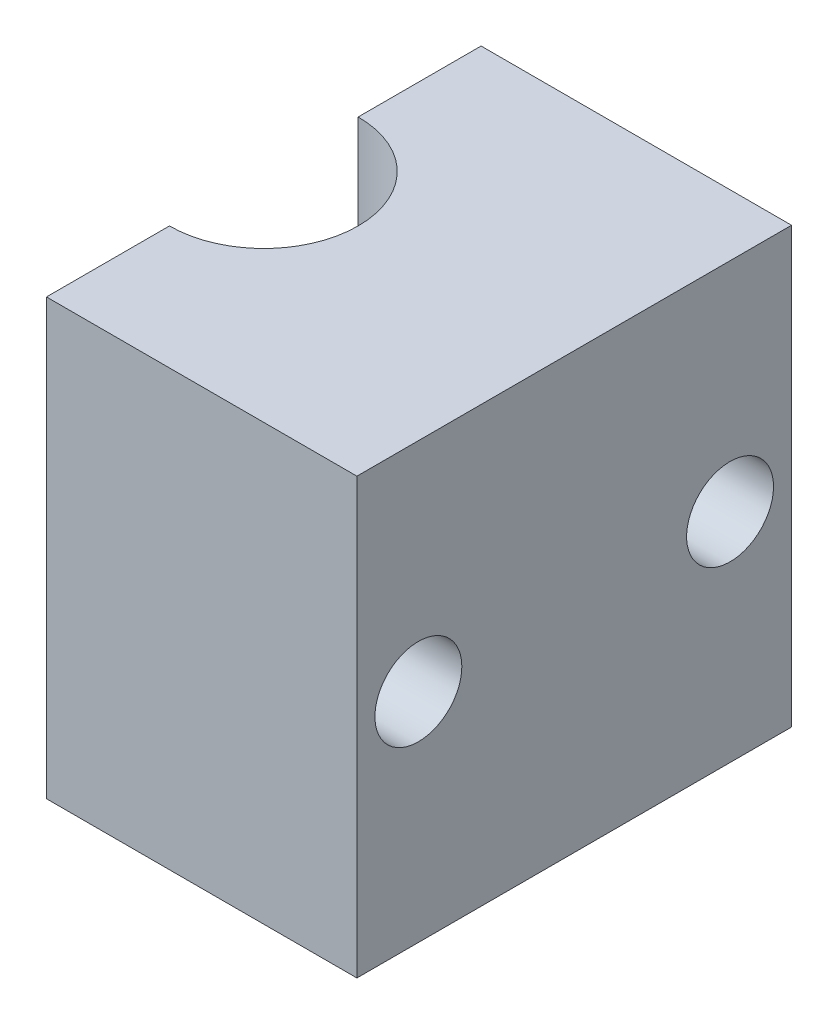
ISO-10303-21;
HEADER;
FILE_DESCRIPTION(('STEP AP214'),'2;1');
FILE_NAME('part.step','',(''),(''),'','','');
FILE_SCHEMA(('AUTOMOTIVE_DESIGN { 1 0 10303 214 1 1 1 1 }'));
ENDSEC;
DATA;
#1=APPLICATION_CONTEXT('core data for automotive mechanical design processes');
#2=APPLICATION_PROTOCOL_DEFINITION('international standard','automotive_design',2000,#1);
#3=PRODUCT_CONTEXT('',#1,'mechanical');
#4=PRODUCT('Part','Part','',(#3));
#5=PRODUCT_RELATED_PRODUCT_CATEGORY('part','',(#4));
#6=PRODUCT_DEFINITION_FORMATION('','',#4);
#7=PRODUCT_DEFINITION_CONTEXT('part definition',#1,'design');
#8=PRODUCT_DEFINITION('design','',#6,#7);
#9=PRODUCT_DEFINITION_SHAPE('','',#8);
#10=(LENGTH_UNIT() NAMED_UNIT(*) SI_UNIT(.MILLI.,.METRE.));
#11=(NAMED_UNIT(*) PLANE_ANGLE_UNIT() SI_UNIT($,.RADIAN.));
#12=(NAMED_UNIT(*) SI_UNIT($,.STERADIAN.) SOLID_ANGLE_UNIT());
#13=UNCERTAINTY_MEASURE_WITH_UNIT(LENGTH_MEASURE(1.E-05),#10,'distance_accuracy_value','');
#14=(GEOMETRIC_REPRESENTATION_CONTEXT(3) GLOBAL_UNCERTAINTY_ASSIGNED_CONTEXT((#13)) GLOBAL_UNIT_ASSIGNED_CONTEXT((#10,
#11,#12)) REPRESENTATION_CONTEXT('',''));
#15=CARTESIAN_POINT('',(0.,0.,0.));
#16=DIRECTION('',(0.,0.,1.));
#17=DIRECTION('',(1.,0.,0.));
#18=AXIS2_PLACEMENT_3D('',#15,#16,#17);
#19=CARTESIAN_POINT('',(-7.47999999999996,17.5,-12.55));
#20=DIRECTION('',(-1.,0.,0.));
#21=DIRECTION('',(0.,0.,1.));
#22=AXIS2_PLACEMENT_3D('',#19,#20,#21);
#23=CYLINDRICAL_SURFACE('',#22,1.5);
#24=CARTESIAN_POINT('',(-32.48,17.5,-12.55));
#25=DIRECTION('',(-1.,0.,0.));
#26=DIRECTION('',(0.,0.,1.));
#27=AXIS2_PLACEMENT_3D('',#24,#25,#26);
#28=CIRCLE('',#27,1.5);
#29=CARTESIAN_POINT('',(-32.48,17.5,-11.05));
#30=VERTEX_POINT('',#29);
#31=EDGE_CURVE('E216',#30,#30,#28,.T.);
#32=ORIENTED_EDGE('',*,*,#31,.T.);
#33=EDGE_LOOP('',(#32));
#34=FACE_BOUND('',#33,.T.);
#35=CARTESIAN_POINT('',(-12.48,17.5,-12.55));
#36=DIRECTION('',(1.,0.,0.));
#37=DIRECTION('',(0.,0.,-1.));
#38=AXIS2_PLACEMENT_3D('',#35,#36,#37);
#39=CIRCLE('',#38,1.5);
#40=CARTESIAN_POINT('',(-12.48,17.5,-14.05));
#41=VERTEX_POINT('',#40);
#42=EDGE_CURVE('E37',#41,#41,#39,.F.);
#43=ORIENTED_EDGE('',*,*,#42,.F.);
#44=EDGE_LOOP('',(#43));
#45=FACE_BOUND('',#44,.T.);
#46=ADVANCED_FACE('F33',(#34,#45),#23,.F.);
#47=CARTESIAN_POINT('',(-7.47999999999996,17.5,12.55));
#48=DIRECTION('',(-1.,0.,0.));
#49=DIRECTION('',(0.,0.,1.));
#50=AXIS2_PLACEMENT_3D('',#47,#48,#49);
#51=CYLINDRICAL_SURFACE('',#50,1.5);
#52=CARTESIAN_POINT('',(-32.48,17.5,12.55));
#53=DIRECTION('',(-1.,0.,0.));
#54=DIRECTION('',(0.,0.,1.));
#55=AXIS2_PLACEMENT_3D('',#52,#53,#54);
#56=CIRCLE('',#55,1.5);
#57=CARTESIAN_POINT('',(-32.48,17.5,14.05));
#58=VERTEX_POINT('',#57);
#59=EDGE_CURVE('E218',#58,#58,#56,.T.);
#60=ORIENTED_EDGE('',*,*,#59,.T.);
#61=EDGE_LOOP('',(#60));
#62=FACE_BOUND('',#61,.T.);
#63=CARTESIAN_POINT('',(-12.48,17.5,12.55));
#64=DIRECTION('',(1.,0.,0.));
#65=DIRECTION('',(0.,0.,-1.));
#66=AXIS2_PLACEMENT_3D('',#63,#64,#65);
#67=CIRCLE('',#66,1.5);
#68=CARTESIAN_POINT('',(-12.48,17.5,11.05));
#69=VERTEX_POINT('',#68);
#70=EDGE_CURVE('E143',#69,#69,#67,.F.);
#71=ORIENTED_EDGE('',*,*,#70,.F.);
#72=EDGE_LOOP('',(#71));
#73=FACE_BOUND('',#72,.T.);
#74=ADVANCED_FACE('F172',(#62,#73),#51,.F.);
#75=CARTESIAN_POINT('',(-7.47999999999997,35.,-17.5));
#76=DIRECTION('',(-1.,0.,0.));
#77=DIRECTION('',(0.,0.,1.));
#78=AXIS2_PLACEMENT_3D('',#75,#76,#77);
#79=PLANE('',#78);
#80=CARTESIAN_POINT('',(-7.47999999999996,17.5,-12.55));
#81=DIRECTION('',(1.,0.,0.));
#82=DIRECTION('',(0.,0.,-1.));
#83=AXIS2_PLACEMENT_3D('',#80,#81,#82);
#84=CIRCLE('',#83,3.5);
#85=CARTESIAN_POINT('',(-7.47999999999996,17.5,-16.05));
#86=VERTEX_POINT('',#85);
#87=EDGE_CURVE('E209',#86,#86,#84,.T.);
#88=ORIENTED_EDGE('',*,*,#87,.F.);
#89=EDGE_LOOP('',(#88));
#90=FACE_BOUND('',#89,.T.);
#91=CARTESIAN_POINT('',(-7.47999999999996,17.5,12.55));
#92=DIRECTION('',(1.,0.,0.));
#93=DIRECTION('',(0.,0.,-1.));
#94=AXIS2_PLACEMENT_3D('',#91,#92,#93);
#95=CIRCLE('',#94,3.5);
#96=CARTESIAN_POINT('',(-7.47999999999996,17.5,9.05));
#97=VERTEX_POINT('',#96);
#98=EDGE_CURVE('E205',#97,#97,#95,.T.);
#99=ORIENTED_EDGE('',*,*,#98,.F.);
#100=EDGE_LOOP('',(#99));
#101=FACE_BOUND('',#100,.T.);
#102=DIRECTION('',(0.,0.,-1.));
#103=VECTOR('',#102,1.);
#104=CARTESIAN_POINT('',(-7.47999999999997,0.,-17.5));
#105=LINE('',#104,#103);
#106=CARTESIAN_POINT('',(-7.47999999999996,0.,17.5));
#107=VERTEX_POINT('',#106);
#108=CARTESIAN_POINT('',(-7.47999999999997,0.,-17.5));
#109=VERTEX_POINT('',#108);
#110=EDGE_CURVE('E120',#107,#109,#105,.T.);
#111=ORIENTED_EDGE('',*,*,#110,.T.);
#112=DIRECTION('',(0.,-1.,0.));
#113=VECTOR('',#112,1.);
#114=CARTESIAN_POINT('',(-7.47999999999997,35.,-17.5));
#115=LINE('',#114,#113);
#116=CARTESIAN_POINT('',(-7.47999999999997,35.,-17.5));
#117=VERTEX_POINT('',#116);
#118=EDGE_CURVE('E11',#117,#109,#115,.T.);
#119=ORIENTED_EDGE('',*,*,#118,.F.);
#120=DIRECTION('',(0.,0.,-1.));
#121=VECTOR('',#120,1.);
#122=CARTESIAN_POINT('',(-7.47999999999997,35.,-17.5));
#123=LINE('',#122,#121);
#124=CARTESIAN_POINT('',(-7.47999999999996,35.,17.5));
#125=VERTEX_POINT('',#124);
#126=EDGE_CURVE('E131',#125,#117,#123,.T.);
#127=ORIENTED_EDGE('',*,*,#126,.F.);
#128=DIRECTION('',(0.,-1.,0.));
#129=VECTOR('',#128,1.);
#130=CARTESIAN_POINT('',(-7.47999999999996,35.,17.5));
#131=LINE('',#130,#129);
#132=EDGE_CURVE('E116',#125,#107,#131,.T.);
#133=ORIENTED_EDGE('',*,*,#132,.T.);
#134=EDGE_LOOP('',(#111,#119,#127,#133));
#135=FACE_BOUND('',#134,.T.);
#136=ADVANCED_FACE('F35',(#90,#101,#135),#79,.F.);
#137=CARTESIAN_POINT('',(-32.48,35.,-17.5));
#138=DIRECTION('',(0.,0.,1.));
#139=DIRECTION('',(1.,0.,0.));
#140=AXIS2_PLACEMENT_3D('',#137,#138,#139);
#141=PLANE('',#140);
#142=DIRECTION('',(-1.,0.,0.));
#143=VECTOR('',#142,1.);
#144=CARTESIAN_POINT('',(-32.48,0.,-17.5));
#145=LINE('',#144,#143);
#146=CARTESIAN_POINT('',(-32.48,0.,-17.5));
#147=VERTEX_POINT('',#146);
#148=EDGE_CURVE('E123',#109,#147,#145,.T.);
#149=ORIENTED_EDGE('',*,*,#148,.T.);
#150=DIRECTION('',(0.,-1.,0.));
#151=VECTOR('',#150,1.);
#152=CARTESIAN_POINT('',(-32.48,35.,-17.5));
#153=LINE('',#152,#151);
#154=CARTESIAN_POINT('',(-32.48,35.,-17.5));
#155=VERTEX_POINT('',#154);
#156=EDGE_CURVE('E43',#155,#147,#153,.T.);
#157=ORIENTED_EDGE('',*,*,#156,.F.);
#158=DIRECTION('',(-1.,0.,0.));
#159=VECTOR('',#158,1.);
#160=CARTESIAN_POINT('',(-32.48,35.,-17.5));
#161=LINE('',#160,#159);
#162=EDGE_CURVE('E89',#117,#155,#161,.T.);
#163=ORIENTED_EDGE('',*,*,#162,.F.);
#164=ORIENTED_EDGE('',*,*,#118,.T.);
#165=EDGE_LOOP('',(#149,#157,#163,#164));
#166=FACE_BOUND('',#165,.T.);
#167=ADVANCED_FACE('F226',(#166),#141,.F.);
#168=CARTESIAN_POINT('',(-32.48,35.,-17.5));
#169=DIRECTION('',(1.,0.,0.));
#170=DIRECTION('',(0.,0.,-1.));
#171=AXIS2_PLACEMENT_3D('',#168,#169,#170);
#172=PLANE('',#171);
#173=ORIENTED_EDGE('',*,*,#31,.F.);
#174=EDGE_LOOP('',(#173));
#175=FACE_BOUND('',#174,.T.);
#176=DIRECTION('',(0.,0.,1.));
#177=VECTOR('',#176,1.);
#178=CARTESIAN_POINT('',(-32.48,0.,-17.5));
#179=LINE('',#178,#177);
#180=CARTESIAN_POINT('',(-32.48,0.,-7.6));
#181=VERTEX_POINT('',#180);
#182=EDGE_CURVE('E126',#147,#181,#179,.T.);
#183=ORIENTED_EDGE('',*,*,#182,.T.);
#184=DIRECTION('',(0.,-1.,0.));
#185=VECTOR('',#184,1.);
#186=CARTESIAN_POINT('',(-32.48,35.,-7.6));
#187=LINE('',#186,#185);
#188=CARTESIAN_POINT('',(-32.48,35.,-7.6));
#189=VERTEX_POINT('',#188);
#190=EDGE_CURVE('E111',#189,#181,#187,.T.);
#191=ORIENTED_EDGE('',*,*,#190,.F.);
#192=DIRECTION('',(0.,0.,1.));
#193=VECTOR('',#192,1.);
#194=CARTESIAN_POINT('',(-32.48,35.,-17.5));
#195=LINE('',#194,#193);
#196=EDGE_CURVE('E102',#155,#189,#195,.T.);
#197=ORIENTED_EDGE('',*,*,#196,.F.);
#198=ORIENTED_EDGE('',*,*,#156,.T.);
#199=EDGE_LOOP('',(#183,#191,#197,#198));
#200=FACE_BOUND('',#199,.T.);
#201=ADVANCED_FACE('F168',(#175,#200),#172,.F.);
#202=CARTESIAN_POINT('',(-32.48,35.,0.));
#203=DIRECTION('',(0.,-1.,0.));
#204=DIRECTION('',(0.,0.,-1.));
#205=AXIS2_PLACEMENT_3D('',#202,#203,#204);
#206=CYLINDRICAL_SURFACE('',#205,7.6);
#207=CARTESIAN_POINT('',(-28.2291177386335,17.5,6.3));
#208=CARTESIAN_POINT('',(-28.2291148667617,17.3876842680063,6.29999891589043));
#209=CARTESIAN_POINT('',(-28.2246436188237,17.2753446664707,6.29698826054719));
#210=CARTESIAN_POINT('',(-28.2069940748641,17.0516296229765,6.28502415434351));
#211=CARTESIAN_POINT('',(-28.1938106769283,16.9402547847332,6.27606722127469));
#212=CARTESIAN_POINT('',(-28.1593745748084,16.7191258820914,6.25240993582619));
#213=CARTESIAN_POINT('',(-28.138103153279,16.609376195381,6.23769625885356));
#214=CARTESIAN_POINT('',(-28.0884451351719,16.3923298306676,6.20283512891558));
#215=CARTESIAN_POINT('',(-28.0600537000576,16.285034875151,6.18268398010548));
#216=CARTESIAN_POINT('',(-27.9852298848271,16.032864347817,6.12861355421361));
#217=CARTESIAN_POINT('',(-27.9360497326561,15.8893005439857,6.09237577987049));
#218=CARTESIAN_POINT('',(-27.8289582653047,15.6081463994727,6.01101721926835));
#219=CARTESIAN_POINT('',(-27.7710461269135,15.4705566235713,5.96589559535881));
#220=CARTESIAN_POINT('',(-27.6487157699404,15.2009167005678,5.86727206914997));
#221=CARTESIAN_POINT('',(-27.5842794581535,15.0688834807602,5.81374662158453));
#222=CARTESIAN_POINT('',(-27.4510240837794,14.8106087532586,5.69887255128853));
#223=CARTESIAN_POINT('',(-27.3822052058591,14.6843670019163,5.63752425807804));
#224=CARTESIAN_POINT('',(-27.2113716052765,14.3839640999135,5.47908367508974));
#225=CARTESIAN_POINT('',(-27.107886301832,14.2127238063655,5.378016652942));
#226=CARTESIAN_POINT('',(-26.8989140641327,13.8812945715832,5.16083612367827));
#227=CARTESIAN_POINT('',(-26.793426307125,13.7211103040112,5.04471631234436));
#228=CARTESIAN_POINT('',(-26.5835429063655,13.4120858826402,4.79771213843507));
#229=CARTESIAN_POINT('',(-26.4791463445872,13.2632353962409,4.6668415003635));
#230=CARTESIAN_POINT('',(-26.2739689742349,12.9773106465582,4.39030851426602));
#231=CARTESIAN_POINT('',(-26.1731868294553,12.8402320046795,4.24465171040154));
#232=CARTESIAN_POINT('',(-25.9982045359767,12.606294721921,3.97075694772539));
#233=CARTESIAN_POINT('',(-25.9228680567328,12.5070365876203,3.84528837483925));
#234=CARTESIAN_POINT('',(-25.7771612774346,12.3171675192557,3.58526866656152));
#235=CARTESIAN_POINT('',(-25.7067898449166,12.2265546116545,3.45071961609839));
#236=CARTESIAN_POINT('',(-25.5723004854362,12.0548965423894,3.1729282219673));
#237=CARTESIAN_POINT('',(-25.5081750963299,11.9738399388274,3.02969659185429));
#238=CARTESIAN_POINT('',(-25.3873244793331,11.8221352403215,2.73483529019645));
#239=CARTESIAN_POINT('',(-25.3305979246341,11.7514852788942,2.58320713134007));
#240=CARTESIAN_POINT('',(-25.2347580422013,11.632757279972,2.29890413128772));
#241=CARTESIAN_POINT('',(-25.1942921518868,11.5828858175031,2.16743222006261));
#242=CARTESIAN_POINT('',(-25.1199646364904,11.4916039535611,1.8997788370325));
#243=CARTESIAN_POINT('',(-25.0861016861818,11.450191854193,1.76359831673001));
#244=CARTESIAN_POINT('',(-25.025606213637,11.3764035975787,1.48728182851436));
#245=CARTESIAN_POINT('',(-24.9989712143717,11.3440243446565,1.34714723388964));
#246=CARTESIAN_POINT('',(-24.9534473235846,11.288781093121,1.06376517847891));
#247=CARTESIAN_POINT('',(-24.9345585216492,11.265917204555,0.920517681711699));
#248=CARTESIAN_POINT('',(-24.9048691218204,11.2300151215662,0.631349565653004));
#249=CARTESIAN_POINT('',(-24.894102405656,11.2170180858494,0.485420321716768));
#250=CARTESIAN_POINT('',(-24.8810285380954,11.2012392584048,0.192629635579012));
#251=CARTESIAN_POINT('',(-24.8787214042574,11.1984574878794,0.0457681914432892));
#252=CARTESIAN_POINT('',(-24.8826196031196,11.2031602678055,-0.247671203877243));
#253=CARTESIAN_POINT('',(-24.8888246727292,11.2106445009608,-0.394249163683621));
#254=CARTESIAN_POINT('',(-24.9096048823799,11.2357417422201,-0.685927509131543));
#255=CARTESIAN_POINT('',(-24.9241797479161,11.2533544181407,-0.831027943072809));
#256=CARTESIAN_POINT('',(-24.9601548982718,11.2969192171474,-1.10917958956484));
#257=CARTESIAN_POINT('',(-24.9810433055621,11.3222467612419,-1.24239568120999));
#258=CARTESIAN_POINT('',(-25.0294592662667,11.3811084381429,-1.50579038684641));
#259=CARTESIAN_POINT('',(-25.0569890677703,11.414645349849,-1.63596795590872));
#260=CARTESIAN_POINT('',(-25.1488506908093,11.52692465627,-2.02080242297498));
#261=CARTESIAN_POINT('',(-25.2224803647418,11.6173663245905,-2.26995200003625));
#262=CARTESIAN_POINT('',(-25.3973855562712,11.8344963184363,-2.76999540781246));
#263=CARTESIAN_POINT('',(-25.5005140021505,11.9636605237383,-3.01914097812484));
#264=CARTESIAN_POINT('',(-25.7248027336431,12.2492395714563,-3.49227021333204));
#265=CARTESIAN_POINT('',(-25.8459703161263,12.4056654456657,-3.71624363139885));
#266=CARTESIAN_POINT('',(-26.1270477818407,12.776886324244,-4.18191258451981));
#267=CARTESIAN_POINT('',(-26.2897788274774,12.9970573327389,-4.41763651030811));
#268=CARTESIAN_POINT('',(-26.5395819443368,13.3496530337498,-4.74238470095639));
#269=CARTESIAN_POINT('',(-26.6239017924029,13.4710618538864,-4.84593103768238));
#270=CARTESIAN_POINT('',(-26.7930594241733,13.7211379220807,-5.04336902181316));
#271=CARTESIAN_POINT('',(-26.8778970519519,13.8498030726622,-5.13726343722415));
#272=CARTESIAN_POINT('',(-27.0466600760135,14.1145022632636,-5.31543959380166));
#273=CARTESIAN_POINT('',(-27.1305841235825,14.250545785903,-5.39970851087025));
#274=CARTESIAN_POINT('',(-27.2955933491775,14.5300155710736,-5.55832885773833));
#275=CARTESIAN_POINT('',(-27.3766778629516,14.6734435419193,-5.63267797828019));
#276=CARTESIAN_POINT('',(-27.533577098543,14.967696933412,-5.77094533677907));
#277=CARTESIAN_POINT('',(-27.6094005263806,15.1185093927643,-5.83488105508983));
#278=CARTESIAN_POINT('',(-27.752973963889,15.4279060539942,-5.95178872919635));
#279=CARTESIAN_POINT('',(-27.8207291489018,15.5864851808238,-6.00476772938125));
#280=CARTESIAN_POINT('',(-27.9593715552867,15.9505992017644,-6.11009081420478));
#281=CARTESIAN_POINT('',(-28.0271588065035,16.1583196880072,-6.15927621478926));
#282=CARTESIAN_POINT('',(-28.1090872104217,16.4775274861947,-6.21741476862343));
#283=CARTESIAN_POINT('',(-28.1330944089649,16.5851210905542,-6.23418124020503));
#284=CARTESIAN_POINT('',(-28.1735777291982,16.8024015953788,-6.26221491746038));
#285=CARTESIAN_POINT('',(-28.1900576679881,16.9120874054146,-6.27348491061459));
#286=CARTESIAN_POINT('',(-28.2148218684258,17.1339276795261,-6.29034865862891));
#287=CARTESIAN_POINT('',(-28.2230236737441,17.2460958225234,-6.29588531911609));
#288=CARTESIAN_POINT('',(-28.2305016550264,17.4708647747704,-6.30093525977525));
#289=CARTESIAN_POINT('',(-28.2297782817618,17.5834655618821,-6.30044884414625));
#290=CARTESIAN_POINT('',(-28.2194433757939,17.8081311717192,-6.2934644477628));
#291=CARTESIAN_POINT('',(-28.2098265980821,17.9201956389355,-6.28696291951132));
#292=CARTESIAN_POINT('',(-28.1822084344889,18.1428300742866,-6.26811479208689));
#293=CARTESIAN_POINT('',(-28.1642024187999,18.2533991824545,-6.25576496532463));
#294=CARTESIAN_POINT('',(-28.1168763616563,18.4913134198957,-6.22287066988253));
#295=CARTESIAN_POINT('',(-28.0861324497654,18.6182283514023,-6.20127394343811));
#296=CARTESIAN_POINT('',(-28.0159600046969,18.8682402519501,-6.15095152070373));
#297=CARTESIAN_POINT('',(-27.9765246273369,18.9913341244213,-6.1222202039368));
#298=CARTESIAN_POINT('',(-27.8906095465501,19.2336013878572,-6.05808320216905));
#299=CARTESIAN_POINT('',(-27.8441116885444,19.3527636827937,-6.02266025698543));
#300=CARTESIAN_POINT('',(-27.7457458783019,19.5867247627257,-5.94564918042104));
#301=CARTESIAN_POINT('',(-27.6938792403603,19.7015246063003,-5.9040625568578));
#302=CARTESIAN_POINT('',(-27.5552377346005,19.9915033323525,-5.78953950835156));
#303=CARTESIAN_POINT('',(-27.4654948792831,20.1635724692422,-5.71229713715119));
#304=CARTESIAN_POINT('',(-27.2802792028258,20.4977357786889,-5.54423825051071));
#305=CARTESIAN_POINT('',(-27.1848033104559,20.659824508786,-5.45341441985093));
#306=CARTESIAN_POINT('',(-26.9912090982867,20.9745095462878,-5.25852339146182));
#307=CARTESIAN_POINT('',(-26.8930876119238,21.1270936825491,-5.15443971259749));
#308=CARTESIAN_POINT('',(-26.6969049011666,21.4225467230691,-4.93332167186165));
#309=CARTESIAN_POINT('',(-26.5988436687895,21.5654174996955,-4.81628981740052));
#310=CARTESIAN_POINT('',(-26.4015406303922,21.8460282198451,-4.56494800141081));
#311=CARTESIAN_POINT('',(-26.3023786751636,21.9834107870859,-4.43017500747694));
#312=CARTESIAN_POINT('',(-26.1086724079017,22.2467635836205,-4.14676390359023));
#313=CARTESIAN_POINT('',(-26.0141288849732,22.3727318657922,-3.99812343677923));
#314=CARTESIAN_POINT('',(-25.8320937334107,22.6118140553739,-3.68750230180722));
#315=CARTESIAN_POINT('',(-25.7445854448835,22.7249586074786,-3.52555510314334));
#316=CARTESIAN_POINT('',(-25.5786054999644,22.9372438484052,-3.18841829787242));
#317=CARTESIAN_POINT('',(-25.5001294291928,23.0363913835031,-3.01323523006912));
#318=CARTESIAN_POINT('',(-25.3764582241842,23.1913771086439,-2.70524056587205));
#319=CARTESIAN_POINT('',(-25.3283686097291,23.2512532066442,-2.57560582704288));
#320=CARTESIAN_POINT('',(-25.2384474810082,23.3626928516526,-2.31072786613414));
#321=CARTESIAN_POINT('',(-25.1966143428542,23.4142585559203,-2.17548611105361));
#322=CARTESIAN_POINT('',(-25.1199561698433,23.5084100695072,-1.90004733353403));
#323=CARTESIAN_POINT('',(-25.0851277751227,23.5510001844887,-1.75985272487912));
#324=CARTESIAN_POINT('',(-25.0231307595864,23.6266114266542,-1.47523235097785));
#325=CARTESIAN_POINT('',(-24.9959623403022,23.6596323020755,-1.33080647451856));
#326=CARTESIAN_POINT('',(-24.949727661416,23.7157264699867,-1.03784208480373));
#327=CARTESIAN_POINT('',(-24.9307101970095,23.7387398649405,-0.889284321101167));
#328=CARTESIAN_POINT('',(-24.9014482515707,23.7741171231678,-0.590043227206412));
#329=CARTESIAN_POINT('',(-24.8912037546336,23.7864810057482,-0.439359900868241));
#330=CARTESIAN_POINT('',(-24.8797343037823,23.8003217123168,-0.137179204972387));
#331=CARTESIAN_POINT('',(-24.8785075969892,23.8018006521212,0.0143180006536518));
#332=CARTESIAN_POINT('',(-24.8850998400524,23.7938472838726,0.316821053009321));
#333=CARTESIAN_POINT('',(-24.8929182274742,23.7844156542513,0.467826929704872));
#334=CARTESIAN_POINT('',(-24.9162992223677,23.7561669755145,0.754454581287962));
#335=CARTESIAN_POINT('',(-24.9310971073584,23.7382763556765,0.890232055368254));
#336=CARTESIAN_POINT('',(-24.9677343739589,23.6938914821568,1.15945154333634));
#337=CARTESIAN_POINT('',(-24.9895761017991,23.6673943617189,1.29289276340646));
#338=CARTESIAN_POINT('',(-25.0398957670989,23.6061817379029,1.55655099521716));
#339=CARTESIAN_POINT('',(-25.0683716373066,23.5714687945876,1.68676899738382));
#340=CARTESIAN_POINT('',(-25.1314768225135,23.4942708630513,1.94337239558163));
#341=CARTESIAN_POINT('',(-25.1661084551758,23.4517829473516,2.06975632701921));
#342=CARTESIAN_POINT('',(-25.2822537247504,23.3086825310549,2.45491059628991));
#343=CARTESIAN_POINT('',(-25.3734121964029,23.1955688080937,2.70627660887144));
#344=CARTESIAN_POINT('',(-25.5751600602669,22.9417606483167,3.18608224196091));
#345=CARTESIAN_POINT('',(-25.6857615104558,22.8010490898135,3.41450749632662));
#346=CARTESIAN_POINT('',(-25.8896495823876,22.5366439528865,3.78945274411982));
#347=CARTESIAN_POINT('',(-25.9797311628983,22.4183589801478,3.94161130825643));
#348=CARTESIAN_POINT('',(-26.1653598466776,22.1702745217663,4.23262306368358));
#349=CARTESIAN_POINT('',(-26.2609071057013,22.0404747079278,4.3714758754993));
#350=CARTESIAN_POINT('',(-26.4556004563345,21.769922965726,4.63612608593521));
#351=CARTESIAN_POINT('',(-26.554754799357,21.6291449581162,4.76189063112206));
#352=CARTESIAN_POINT('',(-26.7542105339638,21.3374483406922,4.9999427628734));
#353=CARTESIAN_POINT('',(-26.8545116442753,21.1865321750381,5.11223357969553));
#354=CARTESIAN_POINT('',(-27.0395765963301,20.8968778891476,5.30822812696452));
#355=CARTESIAN_POINT('',(-27.1245195540585,20.7594646965631,5.39372577998232));
#356=CARTESIAN_POINT('',(-27.2915396397985,20.4770958717542,5.55457601909729));
#357=CARTESIAN_POINT('',(-27.3736162608265,20.332138916404,5.62992681713243));
#358=CARTESIAN_POINT('',(-27.5323590172065,20.0347422291701,5.76992348777546));
#359=CARTESIAN_POINT('',(-27.6090370183953,19.8823202413963,5.83459328661982));
#360=CARTESIAN_POINT('',(-27.7541365360769,19.5695420393742,5.95272711294352));
#361=CARTESIAN_POINT('',(-27.8225635908837,19.4091912502989,6.00619867502128));
#362=CARTESIAN_POINT('',(-27.9635449842395,19.03780044759,6.11321258238597));
#363=CARTESIAN_POINT('',(-28.0326391789985,18.8243256589866,6.16324021264061));
#364=CARTESIAN_POINT('',(-28.11520355897,18.4963085162756,6.22171116624102));
#365=CARTESIAN_POINT('',(-28.1391944303077,18.3858191047931,6.23842858545271));
#366=CARTESIAN_POINT('',(-28.1791663545855,18.162705466062,6.26605347855055));
#367=CARTESIAN_POINT('',(-28.1951525995596,18.0500826719227,6.27696471878256));
#368=CARTESIAN_POINT('',(-28.2141388622078,17.8643849908895,6.28987315674008));
#369=CARTESIAN_POINT('',(-28.2197428100901,17.7916887616836,6.29366581895905));
#370=CARTESIAN_POINT('',(-28.2272336332556,17.6459984285663,6.29872989923891));
#371=CARTESIAN_POINT('',(-28.2291196053254,17.57300425659,6.30000070466187));
#372=CARTESIAN_POINT('',(-28.2291177386335,17.5,6.3));
#373=B_SPLINE_CURVE_WITH_KNOTS('',3,(#207,#208,#209,#210,#211,#212,#213,#214,#215,#216,#217,
#218,#219,#220,#221,#222,#223,#224,#225,#226,#227,#228,#229,#230,#231,#232,#233,#234,#235,#236,
#237,#238,#239,#240,#241,#242,#243,#244,#245,#246,#247,#248,#249,#250,#251,#252,#253,#254,#255,
#256,#257,#258,#259,#260,#261,#262,#263,#264,#265,#266,#267,#268,#269,#270,#271,#272,#273,#274,
#275,#276,#277,#278,#279,#280,#281,#282,#283,#284,#285,#286,#287,#288,#289,#290,#291,#292,#293,
#294,#295,#296,#297,#298,#299,#300,#301,#302,#303,#304,#305,#306,#307,#308,#309,#310,#311,#312,
#313,#314,#315,#316,#317,#318,#319,#320,#321,#322,#323,#324,#325,#326,#327,#328,#329,#330,#331,
#332,#333,#334,#335,#336,#337,#338,#339,#340,#341,#342,#343,#344,#345,#346,#347,#348,#349,#350,
#351,#352,#353,#354,#355,#356,#357,#358,#359,#360,#361,#362,#363,#364,#365,#366,#367,#368,#369,
#370,#371,#372),.UNSPECIFIED.,.T.,.F.,(4,2,2,2,2,2,2,2,2,2,2,2,2,2,2,2,2,2,2,2,2,2,2,2,2,2,2,2,
2,2,2,2,2,2,2,2,2,2,2,2,2,2,2,2,2,2,2,2,2,2,2,2,2,2,2,2,2,2,2,2,2,2,2,2,2,2,2,2,2,2,2,2,2,2,2,2,
2,2,2,2,2,2,4),(0.,0.336862724400323,0.673922893692781,1.01176788422578,1.34984308866481,
1.81714411276208,2.28448921938959,2.75316786897793,3.22182678303305,3.89342277078507,
4.56530094208076,5.23655906414683,5.90756641715968,6.4376027698613,6.96751783459118,
7.49679183858947,8.02597079875074,8.4644965340255,8.90293416529224,9.34122135306741,
9.77951360958293,10.2196242670346,10.6597358379611,11.099833806456,11.5399173418412,
11.9510604435469,12.3623429115526,13.1843291742837,14.0781081476452,14.9722496438158,
16.051990776399,16.5931171604857,17.134087923265,17.6757712184493,18.2175803944257,
18.7584704791481,19.2990117215213,19.9683403638309,20.3025239980539,20.6365379779205,
20.9738470910011,21.3111391681546,21.6486302949317,21.9863078955147,22.3827668308614,
22.7795390843997,23.1773490908431,23.5750619413596,24.2007470146848,24.8267703153311,
25.453579456029,26.0802674270757,26.7290044301291,27.3778518913869,28.0251145752359,
28.672059562306,29.1236715792875,29.5751661747503,30.0264436891305,30.4777330753636,
30.9316875722131,31.3856412460681,31.8395066780317,32.293343889635,32.7061169588173,
33.1190276606348,33.5318098678483,33.9447478192631,34.8122144808797,35.6802210306484,
36.3176502345245,36.9550976122231,37.5941083234281,38.232965527671,38.7808735387864,
39.3288779753512,39.875637683995,40.4220283215773,41.1088645335448,41.4513826102302,
41.7936782309742,42.0125829226509,42.2315407866222),.UNSPECIFIED.);
#374=CARTESIAN_POINT('',(-28.2291177386335,17.5,6.3));
#375=VERTEX_POINT('',#374);
#376=EDGE_CURVE('E124',#375,#375,#373,.T.);
#377=ORIENTED_EDGE('',*,*,#376,.T.);
#378=EDGE_LOOP('',(#377));
#379=FACE_BOUND('',#378,.T.);
#380=CARTESIAN_POINT('',(-32.48,0.,0.));
#381=DIRECTION('',(0.,-1.,0.));
#382=DIRECTION('',(0.,0.,1.));
#383=AXIS2_PLACEMENT_3D('',#380,#381,#382);
#384=CIRCLE('',#383,7.6);
#385=CARTESIAN_POINT('',(-32.48,0.,7.6));
#386=VERTEX_POINT('',#385);
#387=EDGE_CURVE('E110',#181,#386,#384,.T.);
#388=ORIENTED_EDGE('',*,*,#387,.T.);
#389=DIRECTION('',(0.,-1.,0.));
#390=VECTOR('',#389,1.);
#391=CARTESIAN_POINT('',(-32.48,35.,7.6));
#392=LINE('',#391,#390);
#393=CARTESIAN_POINT('',(-32.48,35.,7.6));
#394=VERTEX_POINT('',#393);
#395=EDGE_CURVE('E107',#394,#386,#392,.T.);
#396=ORIENTED_EDGE('',*,*,#395,.F.);
#397=CARTESIAN_POINT('',(-32.48,35.,0.));
#398=DIRECTION('',(0.,-1.,0.));
#399=DIRECTION('',(0.,0.,1.));
#400=AXIS2_PLACEMENT_3D('',#397,#398,#399);
#401=CIRCLE('',#400,7.6);
#402=EDGE_CURVE('E96',#189,#394,#401,.T.);
#403=ORIENTED_EDGE('',*,*,#402,.F.);
#404=ORIENTED_EDGE('',*,*,#190,.T.);
#405=EDGE_LOOP('',(#388,#396,#403,#404));
#406=FACE_BOUND('',#405,.T.);
#407=ADVANCED_FACE('F108',(#379,#406),#206,.F.);
#408=CARTESIAN_POINT('',(-32.48,35.,7.6));
#409=DIRECTION('',(1.,0.,0.));
#410=DIRECTION('',(0.,0.,-1.));
#411=AXIS2_PLACEMENT_3D('',#408,#409,#410);
#412=PLANE('',#411);
#413=ORIENTED_EDGE('',*,*,#59,.F.);
#414=EDGE_LOOP('',(#413));
#415=FACE_BOUND('',#414,.T.);
#416=DIRECTION('',(0.,0.,1.));
#417=VECTOR('',#416,1.);
#418=CARTESIAN_POINT('',(-32.48,0.,7.6));
#419=LINE('',#418,#417);
#420=CARTESIAN_POINT('',(-32.48,0.,17.5));
#421=VERTEX_POINT('',#420);
#422=EDGE_CURVE('E75',#386,#421,#419,.T.);
#423=ORIENTED_EDGE('',*,*,#422,.T.);
#424=DIRECTION('',(0.,-1.,0.));
#425=VECTOR('',#424,1.);
#426=CARTESIAN_POINT('',(-32.48,35.,17.5));
#427=LINE('',#426,#425);
#428=CARTESIAN_POINT('',(-32.48,35.,17.5));
#429=VERTEX_POINT('',#428);
#430=EDGE_CURVE('E112',#429,#421,#427,.T.);
#431=ORIENTED_EDGE('',*,*,#430,.F.);
#432=DIRECTION('',(0.,0.,1.));
#433=VECTOR('',#432,1.);
#434=CARTESIAN_POINT('',(-32.48,35.,7.6));
#435=LINE('',#434,#433);
#436=EDGE_CURVE('E100',#394,#429,#435,.T.);
#437=ORIENTED_EDGE('',*,*,#436,.F.);
#438=ORIENTED_EDGE('',*,*,#395,.T.);
#439=EDGE_LOOP('',(#423,#431,#437,#438));
#440=FACE_BOUND('',#439,.T.);
#441=ADVANCED_FACE('F114',(#415,#440),#412,.F.);
#442=CARTESIAN_POINT('',(-32.48,35.,17.5));
#443=DIRECTION('',(0.,0.,-1.));
#444=DIRECTION('',(-1.,0.,0.));
#445=AXIS2_PLACEMENT_3D('',#442,#443,#444);
#446=PLANE('',#445);
#447=DIRECTION('',(1.,0.,0.));
#448=VECTOR('',#447,1.);
#449=CARTESIAN_POINT('',(-32.48,0.,17.5));
#450=LINE('',#449,#448);
#451=EDGE_CURVE('E81',#421,#107,#450,.T.);
#452=ORIENTED_EDGE('',*,*,#451,.T.);
#453=ORIENTED_EDGE('',*,*,#132,.F.);
#454=DIRECTION('',(1.,0.,0.));
#455=VECTOR('',#454,1.);
#456=CARTESIAN_POINT('',(-32.48,35.,17.5));
#457=LINE('',#456,#455);
#458=EDGE_CURVE('E52',#429,#125,#457,.T.);
#459=ORIENTED_EDGE('',*,*,#458,.F.);
#460=ORIENTED_EDGE('',*,*,#430,.T.);
#461=EDGE_LOOP('',(#452,#453,#459,#460));
#462=FACE_BOUND('',#461,.T.);
#463=ADVANCED_FACE('F158',(#462),#446,.F.);
#464=CARTESIAN_POINT('',(-32.48,35.,0.));
#465=DIRECTION('',(0.,1.,0.));
#466=DIRECTION('',(0.,0.,1.));
#467=AXIS2_PLACEMENT_3D('',#464,#465,#466);
#468=PLANE('',#467);
#469=ORIENTED_EDGE('',*,*,#126,.T.);
#470=ORIENTED_EDGE('',*,*,#162,.T.);
#471=ORIENTED_EDGE('',*,*,#196,.T.);
#472=ORIENTED_EDGE('',*,*,#402,.T.);
#473=ORIENTED_EDGE('',*,*,#436,.T.);
#474=ORIENTED_EDGE('',*,*,#458,.T.);
#475=EDGE_LOOP('',(#469,#470,#471,#472,#473,#474));
#476=FACE_BOUND('',#475,.T.);
#477=ADVANCED_FACE('F98',(#476),#468,.T.);
#478=CARTESIAN_POINT('',(-32.48,0.,0.));
#479=DIRECTION('',(0.,1.,0.));
#480=DIRECTION('',(0.,0.,1.));
#481=AXIS2_PLACEMENT_3D('',#478,#479,#480);
#482=PLANE('',#481);
#483=ORIENTED_EDGE('',*,*,#110,.F.);
#484=ORIENTED_EDGE('',*,*,#451,.F.);
#485=ORIENTED_EDGE('',*,*,#422,.F.);
#486=ORIENTED_EDGE('',*,*,#387,.F.);
#487=ORIENTED_EDGE('',*,*,#182,.F.);
#488=ORIENTED_EDGE('',*,*,#148,.F.);
#489=EDGE_LOOP('',(#483,#484,#485,#486,#487,#488));
#490=FACE_BOUND('',#489,.T.);
#491=ADVANCED_FACE('F153',(#490),#482,.F.);
#492=CARTESIAN_POINT('',(-12.48,17.5,0.));
#493=DIRECTION('',(-1.,0.,0.));
#494=DIRECTION('',(0.,0.,1.));
#495=AXIS2_PLACEMENT_3D('',#492,#493,#494);
#496=CYLINDRICAL_SURFACE('',#495,6.3);
#497=CARTESIAN_POINT('',(-12.48,17.5,0.));
#498=DIRECTION('',(-1.,0.,0.));
#499=DIRECTION('',(0.,0.,1.));
#500=AXIS2_PLACEMENT_3D('',#497,#498,#499);
#501=CIRCLE('',#500,6.3);
#502=CARTESIAN_POINT('',(-12.48,17.5,6.3));
#503=VERTEX_POINT('',#502);
#504=EDGE_CURVE('E142',#503,#503,#501,.T.);
#505=ORIENTED_EDGE('',*,*,#504,.F.);
#506=EDGE_LOOP('',(#505));
#507=FACE_BOUND('',#506,.T.);
#508=ORIENTED_EDGE('',*,*,#376,.F.);
#509=EDGE_LOOP('',(#508));
#510=FACE_BOUND('',#509,.T.);
#511=ADVANCED_FACE('F147',(#507,#510),#496,.F.);
#512=CARTESIAN_POINT('',(-12.48,17.5,0.));
#513=DIRECTION('',(-1.,0.,0.));
#514=DIRECTION('',(0.,0.,1.));
#515=AXIS2_PLACEMENT_3D('',#512,#513,#514);
#516=PLANE('',#515);
#517=ORIENTED_EDGE('',*,*,#504,.T.);
#518=EDGE_LOOP('',(#517));
#519=FACE_BOUND('',#518,.T.);
#520=ADVANCED_FACE('F152',(#519),#516,.T.);
#521=CARTESIAN_POINT('',(-12.48,17.5,12.55));
#522=DIRECTION('',(1.,0.,0.));
#523=DIRECTION('',(0.,0.,-1.));
#524=AXIS2_PLACEMENT_3D('',#521,#522,#523);
#525=PLANE('',#524);
#526=CARTESIAN_POINT('',(-12.48,17.5,12.55));
#527=DIRECTION('',(1.,0.,0.));
#528=DIRECTION('',(0.,0.,-1.));
#529=AXIS2_PLACEMENT_3D('',#526,#527,#528);
#530=CIRCLE('',#529,3.5);
#531=CARTESIAN_POINT('',(-12.48,17.5,9.05));
#532=VERTEX_POINT('',#531);
#533=EDGE_CURVE('E207',#532,#532,#530,.T.);
#534=ORIENTED_EDGE('',*,*,#533,.T.);
#535=EDGE_LOOP('',(#534));
#536=FACE_BOUND('',#535,.T.);
#537=ORIENTED_EDGE('',*,*,#70,.T.);
#538=EDGE_LOOP('',(#537));
#539=FACE_BOUND('',#538,.T.);
#540=ADVANCED_FACE('F186',(#536,#539),#525,.T.);
#541=CARTESIAN_POINT('',(-12.48,17.5,12.55));
#542=DIRECTION('',(1.,0.,0.));
#543=DIRECTION('',(0.,0.,-1.));
#544=AXIS2_PLACEMENT_3D('',#541,#542,#543);
#545=CYLINDRICAL_SURFACE('',#544,3.5);
#546=ORIENTED_EDGE('',*,*,#533,.F.);
#547=EDGE_LOOP('',(#546));
#548=FACE_BOUND('',#547,.T.);
#549=ORIENTED_EDGE('',*,*,#98,.T.);
#550=EDGE_LOOP('',(#549));
#551=FACE_BOUND('',#550,.T.);
#552=ADVANCED_FACE('F182',(#548,#551),#545,.F.);
#553=CARTESIAN_POINT('',(-12.48,17.5,-12.55));
#554=DIRECTION('',(1.,0.,0.));
#555=DIRECTION('',(0.,0.,-1.));
#556=AXIS2_PLACEMENT_3D('',#553,#554,#555);
#557=PLANE('',#556);
#558=CARTESIAN_POINT('',(-12.48,17.5,-12.55));
#559=DIRECTION('',(1.,0.,0.));
#560=DIRECTION('',(0.,0.,-1.));
#561=AXIS2_PLACEMENT_3D('',#558,#559,#560);
#562=CIRCLE('',#561,3.5);
#563=CARTESIAN_POINT('',(-12.48,17.5,-16.05));
#564=VERTEX_POINT('',#563);
#565=EDGE_CURVE('E202',#564,#564,#562,.T.);
#566=ORIENTED_EDGE('',*,*,#565,.T.);
#567=EDGE_LOOP('',(#566));
#568=FACE_BOUND('',#567,.T.);
#569=ORIENTED_EDGE('',*,*,#42,.T.);
#570=EDGE_LOOP('',(#569));
#571=FACE_BOUND('',#570,.T.);
#572=ADVANCED_FACE('F185',(#568,#571),#557,.T.);
#573=CARTESIAN_POINT('',(-12.48,17.5,-12.55));
#574=DIRECTION('',(1.,0.,0.));
#575=DIRECTION('',(0.,0.,-1.));
#576=AXIS2_PLACEMENT_3D('',#573,#574,#575);
#577=CYLINDRICAL_SURFACE('',#576,3.5);
#578=ORIENTED_EDGE('',*,*,#565,.F.);
#579=EDGE_LOOP('',(#578));
#580=FACE_BOUND('',#579,.T.);
#581=ORIENTED_EDGE('',*,*,#87,.T.);
#582=EDGE_LOOP('',(#581));
#583=FACE_BOUND('',#582,.T.);
#584=ADVANCED_FACE('F191',(#580,#583),#577,.F.);
#585=CLOSED_SHELL('',(#46,#74,#136,#167,#201,#407,#441,#463,#477,#491,#511,#520,#540,#552,#572,#584));
#586=MANIFOLD_SOLID_BREP('B2',#585);
#587=ADVANCED_BREP_SHAPE_REPRESENTATION('',(#18,#586),#14);
#588=SHAPE_DEFINITION_REPRESENTATION(#9,#587);
ENDSEC;
END-ISO-10303-21;
